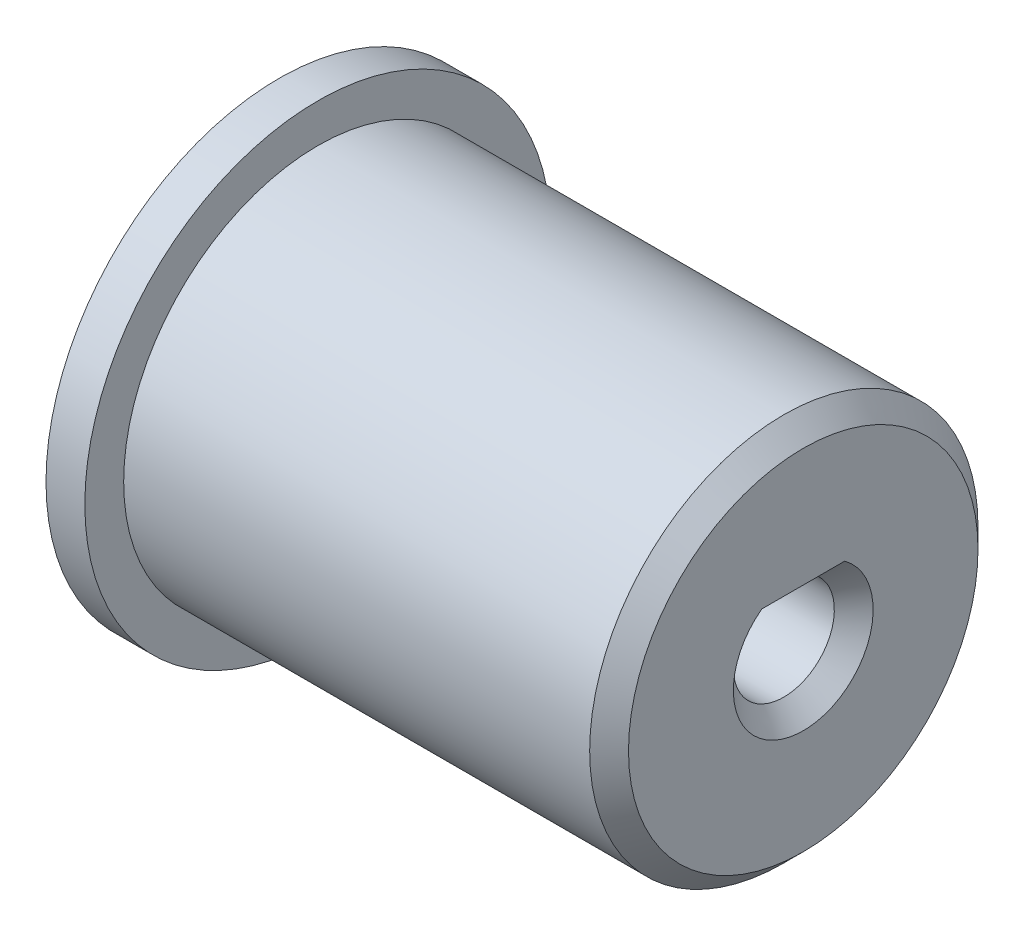
ISO-10303-21;
HEADER;
FILE_DESCRIPTION(('STEP AP214'),'2;1');
FILE_NAME('part.step','',(''),(''),'','','');
FILE_SCHEMA(('AUTOMOTIVE_DESIGN { 1 0 10303 214 1 1 1 1 }'));
ENDSEC;
DATA;
#1=APPLICATION_CONTEXT('core data for automotive mechanical design processes');
#2=APPLICATION_PROTOCOL_DEFINITION('international standard','automotive_design',2000,#1);
#3=PRODUCT_CONTEXT('',#1,'mechanical');
#4=PRODUCT('Part','Part','',(#3));
#5=PRODUCT_RELATED_PRODUCT_CATEGORY('part','',(#4));
#6=PRODUCT_DEFINITION_FORMATION('','',#4);
#7=PRODUCT_DEFINITION_CONTEXT('part definition',#1,'design');
#8=PRODUCT_DEFINITION('design','',#6,#7);
#9=PRODUCT_DEFINITION_SHAPE('','',#8);
#10=(LENGTH_UNIT() NAMED_UNIT(*) SI_UNIT(.MILLI.,.METRE.));
#11=(NAMED_UNIT(*) PLANE_ANGLE_UNIT() SI_UNIT($,.RADIAN.));
#12=(NAMED_UNIT(*) SI_UNIT($,.STERADIAN.) SOLID_ANGLE_UNIT());
#13=UNCERTAINTY_MEASURE_WITH_UNIT(LENGTH_MEASURE(1.E-05),#10,'distance_accuracy_value','');
#14=(GEOMETRIC_REPRESENTATION_CONTEXT(3) GLOBAL_UNCERTAINTY_ASSIGNED_CONTEXT((#13)) GLOBAL_UNIT_ASSIGNED_CONTEXT((#10,
#11,#12)) REPRESENTATION_CONTEXT('',''));
#15=CARTESIAN_POINT('',(0.,0.,0.));
#16=DIRECTION('',(0.,0.,1.));
#17=DIRECTION('',(1.,0.,0.));
#18=AXIS2_PLACEMENT_3D('',#15,#16,#17);
#19=CARTESIAN_POINT('',(25.,0.,0.));
#20=DIRECTION('',(-1.,0.,0.));
#21=DIRECTION('',(0.,0.,1.));
#22=AXIS2_PLACEMENT_3D('',#19,#20,#21);
#23=CYLINDRICAL_SURFACE('',#22,10.);
#24=CARTESIAN_POINT('',(24.,0.,0.));
#25=DIRECTION('',(1.,0.,0.));
#26=DIRECTION('',(0.,0.,-1.));
#27=AXIS2_PLACEMENT_3D('',#24,#25,#26);
#28=CIRCLE('',#27,10.);
#29=CARTESIAN_POINT('',(24.,0.,-10.));
#30=VERTEX_POINT('',#29);
#31=EDGE_CURVE('E247',#30,#30,#28,.F.);
#32=ORIENTED_EDGE('',*,*,#31,.T.);
#33=EDGE_LOOP('',(#32));
#34=FACE_BOUND('',#33,.T.);
#35=CARTESIAN_POINT('',(0.,0.,0.));
#36=DIRECTION('',(1.,0.,0.));
#37=DIRECTION('',(0.,0.,-1.));
#38=AXIS2_PLACEMENT_3D('',#35,#36,#37);
#39=CIRCLE('',#38,10.);
#40=CARTESIAN_POINT('',(0.,0.,-10.));
#41=VERTEX_POINT('',#40);
#42=EDGE_CURVE('E128',#41,#41,#39,.T.);
#43=ORIENTED_EDGE('',*,*,#42,.T.);
#44=EDGE_LOOP('',(#43));
#45=FACE_BOUND('',#44,.T.);
#46=ADVANCED_FACE('F47',(#34,#45),#23,.T.);
#47=CARTESIAN_POINT('',(25.,0.,0.));
#48=DIRECTION('',(1.,0.,0.));
#49=DIRECTION('',(0.,0.,-1.));
#50=AXIS2_PLACEMENT_3D('',#47,#48,#49);
#51=PLANE('',#50);
#52=CARTESIAN_POINT('',(25.,0.,0.));
#53=DIRECTION('',(1.,0.,0.));
#54=DIRECTION('',(0.,0.,-1.));
#55=AXIS2_PLACEMENT_3D('',#52,#53,#54);
#56=CIRCLE('',#55,9.00000000000001);
#57=CARTESIAN_POINT('',(25.,0.,-9.00000000000001));
#58=VERTEX_POINT('',#57);
#59=EDGE_CURVE('E149',#58,#58,#56,.T.);
#60=ORIENTED_EDGE('',*,*,#59,.T.);
#61=EDGE_LOOP('',(#60));
#62=FACE_BOUND('',#61,.T.);
#63=CARTESIAN_POINT('',(25.,0.,0.));
#64=DIRECTION('',(1.,0.,0.));
#65=DIRECTION('',(0.,0.,-1.));
#66=AXIS2_PLACEMENT_3D('',#63,#64,#65);
#67=CIRCLE('',#66,3.60000000000001);
#68=CARTESIAN_POINT('',(25.,2.90000000000001,-2.13307290077016));
#69=VERTEX_POINT('',#68);
#70=CARTESIAN_POINT('',(25.,2.90000000000001,2.13307290077016));
#71=VERTEX_POINT('',#70);
#72=EDGE_CURVE('E61',#69,#71,#67,.F.);
#73=ORIENTED_EDGE('',*,*,#72,.T.);
#74=DIRECTION('',(0.,0.,-1.));
#75=VECTOR('',#74,1.);
#76=CARTESIAN_POINT('',(25.,2.90000000000001,-1.77482393492989));
#77=LINE('',#76,#75);
#78=EDGE_CURVE('E141',#71,#69,#77,.T.);
#79=ORIENTED_EDGE('',*,*,#78,.T.);
#80=EDGE_LOOP('',(#73,#79));
#81=FACE_BOUND('',#80,.T.);
#82=ADVANCED_FACE('F199',(#62,#81),#51,.T.);
#83=CARTESIAN_POINT('',(-2.,0.,0.));
#84=DIRECTION('',(1.,0.,0.));
#85=DIRECTION('',(0.,0.,-1.));
#86=AXIS2_PLACEMENT_3D('',#83,#84,#85);
#87=CYLINDRICAL_SURFACE('',#86,12.);
#88=CARTESIAN_POINT('',(-2.,0.,0.));
#89=DIRECTION('',(-1.,0.,0.));
#90=DIRECTION('',(0.,0.,1.));
#91=AXIS2_PLACEMENT_3D('',#88,#89,#90);
#92=CIRCLE('',#91,12.);
#93=CARTESIAN_POINT('',(-2.,0.,12.));
#94=VERTEX_POINT('',#93);
#95=EDGE_CURVE('E127',#94,#94,#92,.T.);
#96=ORIENTED_EDGE('',*,*,#95,.F.);
#97=EDGE_LOOP('',(#96));
#98=FACE_BOUND('',#97,.T.);
#99=CARTESIAN_POINT('',(0.,0.,0.));
#100=DIRECTION('',(-1.,0.,0.));
#101=DIRECTION('',(0.,0.,1.));
#102=AXIS2_PLACEMENT_3D('',#99,#100,#101);
#103=CIRCLE('',#102,12.);
#104=CARTESIAN_POINT('',(0.,0.,12.));
#105=VERTEX_POINT('',#104);
#106=EDGE_CURVE('E124',#105,#105,#103,.T.);
#107=ORIENTED_EDGE('',*,*,#106,.T.);
#108=EDGE_LOOP('',(#107));
#109=FACE_BOUND('',#108,.T.);
#110=ADVANCED_FACE('F202',(#98,#109),#87,.T.);
#111=CARTESIAN_POINT('',(-2.,0.,0.));
#112=DIRECTION('',(-1.,0.,0.));
#113=DIRECTION('',(0.,0.,1.));
#114=AXIS2_PLACEMENT_3D('',#111,#112,#113);
#115=PLANE('',#114);
#116=CARTESIAN_POINT('',(-2.,0.,4.25));
#117=DIRECTION('',(-1.,0.,0.));
#118=DIRECTION('',(0.,0.,1.));
#119=AXIS2_PLACEMENT_3D('',#116,#117,#118);
#120=CIRCLE('',#119,2.55000000000002);
#121=CARTESIAN_POINT('',(-2.,0.,6.80000000000002));
#122=VERTEX_POINT('',#121);
#123=EDGE_CURVE('E56',#122,#122,#120,.F.);
#124=ORIENTED_EDGE('',*,*,#123,.T.);
#125=EDGE_LOOP('',(#124));
#126=FACE_BOUND('',#125,.T.);
#127=CARTESIAN_POINT('',(-2.,0.,-4.25));
#128=DIRECTION('',(-1.,0.,0.));
#129=DIRECTION('',(0.,0.,1.));
#130=AXIS2_PLACEMENT_3D('',#127,#128,#129);
#131=CIRCLE('',#130,2.55000000000002);
#132=CARTESIAN_POINT('',(-2.,0.,-1.69999999999998));
#133=VERTEX_POINT('',#132);
#134=EDGE_CURVE('E249',#133,#133,#131,.F.);
#135=ORIENTED_EDGE('',*,*,#134,.T.);
#136=EDGE_LOOP('',(#135));
#137=FACE_BOUND('',#136,.T.);
#138=ORIENTED_EDGE('',*,*,#95,.T.);
#139=EDGE_LOOP('',(#138));
#140=FACE_BOUND('',#139,.T.);
#141=ADVANCED_FACE('F213',(#126,#137,#140),#115,.T.);
#142=CARTESIAN_POINT('',(0.,0.,0.));
#143=DIRECTION('',(-1.,0.,0.));
#144=DIRECTION('',(0.,0.,1.));
#145=AXIS2_PLACEMENT_3D('',#142,#143,#144);
#146=PLANE('',#145);
#147=ORIENTED_EDGE('',*,*,#42,.F.);
#148=EDGE_LOOP('',(#147));
#149=FACE_BOUND('',#148,.T.);
#150=ORIENTED_EDGE('',*,*,#106,.F.);
#151=EDGE_LOOP('',(#150));
#152=FACE_BOUND('',#151,.T.);
#153=ADVANCED_FACE('F214',(#149,#152),#146,.F.);
#154=CARTESIAN_POINT('',(9.99999999999999,0.,0.));
#155=DIRECTION('',(1.,0.,0.));
#156=DIRECTION('',(0.,0.,-1.));
#157=AXIS2_PLACEMENT_3D('',#154,#155,#156);
#158=CYLINDRICAL_SURFACE('',#157,2.6);
#159=DIRECTION('',(1.,0.,0.));
#160=VECTOR('',#159,1.);
#161=CARTESIAN_POINT('',(9.99999999999999,1.9,1.77482393492989));
#162=LINE('',#161,#160);
#163=CARTESIAN_POINT('',(9.99999999999999,1.9,1.77482393492989));
#164=VERTEX_POINT('',#163);
#165=CARTESIAN_POINT('',(24.,1.9,1.77482393492989));
#166=VERTEX_POINT('',#165);
#167=EDGE_CURVE('E118',#164,#166,#162,.T.);
#168=ORIENTED_EDGE('',*,*,#167,.T.);
#169=CARTESIAN_POINT('',(24.,0.,0.));
#170=DIRECTION('',(1.,0.,0.));
#171=DIRECTION('',(0.,0.,-1.));
#172=AXIS2_PLACEMENT_3D('',#169,#170,#171);
#173=CIRCLE('',#172,2.6);
#174=CARTESIAN_POINT('',(24.,1.9,-1.77482393492989));
#175=VERTEX_POINT('',#174);
#176=EDGE_CURVE('E148',#166,#175,#173,.T.);
#177=ORIENTED_EDGE('',*,*,#176,.T.);
#178=DIRECTION('',(1.,0.,0.));
#179=VECTOR('',#178,1.);
#180=CARTESIAN_POINT('',(9.99999999999999,1.9,-1.77482393492989));
#181=LINE('',#180,#179);
#182=CARTESIAN_POINT('',(9.99999999999999,1.9,-1.77482393492989));
#183=VERTEX_POINT('',#182);
#184=EDGE_CURVE('E120',#183,#175,#181,.T.);
#185=ORIENTED_EDGE('',*,*,#184,.F.);
#186=CARTESIAN_POINT('',(9.99999999999999,0.,0.));
#187=DIRECTION('',(1.,0.,0.));
#188=DIRECTION('',(0.,0.,-1.));
#189=AXIS2_PLACEMENT_3D('',#186,#187,#188);
#190=CIRCLE('',#189,2.6);
#191=EDGE_CURVE('E108',#164,#183,#190,.T.);
#192=ORIENTED_EDGE('',*,*,#191,.F.);
#193=EDGE_LOOP('',(#168,#177,#185,#192));
#194=FACE_BOUND('',#193,.T.);
#195=ADVANCED_FACE('F217',(#194),#158,.F.);
#196=CARTESIAN_POINT('',(9.99999999999999,1.9,1.77482393492989));
#197=DIRECTION('',(0.,1.,0.));
#198=DIRECTION('',(0.,0.,1.));
#199=AXIS2_PLACEMENT_3D('',#196,#197,#198);
#200=PLANE('',#199);
#201=ORIENTED_EDGE('',*,*,#184,.T.);
#202=DIRECTION('',(0.,0.,1.));
#203=VECTOR('',#202,1.);
#204=CARTESIAN_POINT('',(24.,1.9,1.77482393492989));
#205=LINE('',#204,#203);
#206=EDGE_CURVE('E139',#175,#166,#205,.T.);
#207=ORIENTED_EDGE('',*,*,#206,.T.);
#208=ORIENTED_EDGE('',*,*,#167,.F.);
#209=DIRECTION('',(0.,0.,1.));
#210=VECTOR('',#209,1.);
#211=CARTESIAN_POINT('',(9.99999999999999,1.9,1.77482393492989));
#212=LINE('',#211,#210);
#213=EDGE_CURVE('E114',#183,#164,#212,.T.);
#214=ORIENTED_EDGE('',*,*,#213,.F.);
#215=EDGE_LOOP('',(#201,#207,#208,#214));
#216=FACE_BOUND('',#215,.T.);
#217=ADVANCED_FACE('F223',(#216),#200,.F.);
#218=CARTESIAN_POINT('',(9.99999999999999,0.,0.));
#219=DIRECTION('',(1.,0.,0.));
#220=DIRECTION('',(0.,0.,-1.));
#221=AXIS2_PLACEMENT_3D('',#218,#219,#220);
#222=PLANE('',#221);
#223=ORIENTED_EDGE('',*,*,#191,.T.);
#224=ORIENTED_EDGE('',*,*,#213,.T.);
#225=EDGE_LOOP('',(#223,#224));
#226=FACE_BOUND('',#225,.T.);
#227=ADVANCED_FACE('F174',(#226),#222,.T.);
#228=CARTESIAN_POINT('',(24.,0.,0.));
#229=DIRECTION('',(1.,0.,0.));
#230=DIRECTION('',(0.,0.,-1.));
#231=AXIS2_PLACEMENT_3D('',#228,#229,#230);
#232=CONICAL_SURFACE('',#231,2.6,0.785398163397451);
#233=CARTESIAN_POINT('',(24.,1.9,1.77482393492989));
#234=CARTESIAN_POINT('',(24.0828218189625,1.98282181896255,1.80748053933933));
#235=CARTESIAN_POINT('',(24.1658034598061,2.06580345980609,1.83931634121937));
#236=CARTESIAN_POINT('',(24.332029277271,2.23202927727105,1.90153004187719));
#237=CARTESIAN_POINT('',(24.4152734214577,2.31527342145772,1.93190811378654));
#238=CARTESIAN_POINT('',(24.5819830489262,2.48198304892625,1.9913963757484));
#239=CARTESIAN_POINT('',(24.6654485218535,2.56544852185349,2.02050662404199));
#240=CARTESIAN_POINT('',(24.8325824747131,2.73258247471316,2.07760108432667));
#241=CARTESIAN_POINT('',(24.9162509775886,2.81625097758856,2.10558516211079));
#242=CARTESIAN_POINT('',(25.,2.90000000000001,2.13307290077016));
#243=B_SPLINE_CURVE_WITH_KNOTS('',3,(#233,#234,#235,#236,#237,#238,#239,#240,#241,#242),
.UNSPECIFIED.,.F.,.F.,(4,2,2,2,4),(0.,0.364778310430288,0.729513189124214,1.09423129497589,
1.45899273674608),.UNSPECIFIED.);
#244=EDGE_CURVE('E106',#71,#166,#243,.F.);
#245=ORIENTED_EDGE('',*,*,#244,.F.);
#246=ORIENTED_EDGE('',*,*,#72,.F.);
#247=CARTESIAN_POINT('',(25.,2.90000000000001,-2.13307290077016));
#248=CARTESIAN_POINT('',(24.9162509775886,2.81625097758856,-2.10558516211079));
#249=CARTESIAN_POINT('',(24.8325824747132,2.73258247471316,-2.07760108432667));
#250=CARTESIAN_POINT('',(24.6654485218535,2.56544852185349,-2.02050662404199));
#251=CARTESIAN_POINT('',(24.5819830489262,2.48198304892625,-1.9913963757484));
#252=CARTESIAN_POINT('',(24.4152734214577,2.31527342145772,-1.93190811378654));
#253=CARTESIAN_POINT('',(24.332029277271,2.23202927727105,-1.90153004187719));
#254=CARTESIAN_POINT('',(24.1658034598061,2.06580345980609,-1.83931634121937));
#255=CARTESIAN_POINT('',(24.0828218189625,1.98282181896255,-1.80748053933933));
#256=CARTESIAN_POINT('',(24.,1.9,-1.77482393492989));
#257=B_SPLINE_CURVE_WITH_KNOTS('',3,(#247,#248,#249,#250,#251,#252,#253,#254,#255,#256),
.UNSPECIFIED.,.F.,.F.,(4,2,2,2,4),(0.,0.364761441770191,0.729479547621869,1.09421442631579,
1.45899273674608),.UNSPECIFIED.);
#258=EDGE_CURVE('E75',#175,#69,#257,.F.);
#259=ORIENTED_EDGE('',*,*,#258,.F.);
#260=ORIENTED_EDGE('',*,*,#176,.F.);
#261=EDGE_LOOP('',(#245,#246,#259,#260));
#262=FACE_BOUND('',#261,.T.);
#263=ADVANCED_FACE('F169',(#262),#232,.F.);
#264=CARTESIAN_POINT('',(24.,1.9,1.77482393492989));
#265=DIRECTION('',(0.707106781186549,-0.707106781186546,0.));
#266=DIRECTION('',(0.,0.,-1.));
#267=AXIS2_PLACEMENT_3D('',#264,#265,#266);
#268=PLANE('',#267);
#269=ORIENTED_EDGE('',*,*,#258,.T.);
#270=ORIENTED_EDGE('',*,*,#78,.F.);
#271=ORIENTED_EDGE('',*,*,#244,.T.);
#272=ORIENTED_EDGE('',*,*,#206,.F.);
#273=EDGE_LOOP('',(#269,#270,#271,#272));
#274=FACE_BOUND('',#273,.T.);
#275=ADVANCED_FACE('F163',(#274),#268,.T.);
#276=CARTESIAN_POINT('',(25.,0.,0.));
#277=DIRECTION('',(-1.,0.,0.));
#278=DIRECTION('',(0.,0.,1.));
#279=AXIS2_PLACEMENT_3D('',#276,#277,#278);
#280=CONICAL_SURFACE('',#279,9.00000000000001,0.785398163397445);
#281=ORIENTED_EDGE('',*,*,#31,.F.);
#282=EDGE_LOOP('',(#281));
#283=FACE_BOUND('',#282,.T.);
#284=ORIENTED_EDGE('',*,*,#59,.F.);
#285=EDGE_LOOP('',(#284));
#286=FACE_BOUND('',#285,.T.);
#287=ADVANCED_FACE('F179',(#283,#286),#280,.T.);
#288=CARTESIAN_POINT('',(5.,0.,4.25));
#289=DIRECTION('',(-1.,0.,0.));
#290=DIRECTION('',(0.,0.,1.));
#291=AXIS2_PLACEMENT_3D('',#288,#289,#290);
#292=CONICAL_SURFACE('',#291,1.55,1.02974425867665);
#293=CARTESIAN_POINT('',(5.93133395949272,0.,4.25));
#294=VERTEX_POINT('',#293);
#295=VERTEX_LOOP('',#294);
#296=FACE_BOUND('',#295,.T.);
#297=CARTESIAN_POINT('',(5.,0.,4.25));
#298=DIRECTION('',(-1.,0.,0.));
#299=DIRECTION('',(0.,0.,1.));
#300=AXIS2_PLACEMENT_3D('',#297,#298,#299);
#301=CIRCLE('',#300,1.55);
#302=CARTESIAN_POINT('',(5.,0.,5.8));
#303=VERTEX_POINT('',#302);
#304=EDGE_CURVE('E105',#303,#303,#301,.T.);
#305=ORIENTED_EDGE('',*,*,#304,.T.);
#306=EDGE_LOOP('',(#305));
#307=FACE_BOUND('',#306,.T.);
#308=ADVANCED_FACE('F181',(#296,#307),#292,.F.);
#309=CARTESIAN_POINT('',(-2.,0.,4.25));
#310=DIRECTION('',(-1.,0.,0.));
#311=DIRECTION('',(0.,0.,1.));
#312=AXIS2_PLACEMENT_3D('',#309,#310,#311);
#313=CYLINDRICAL_SURFACE('',#312,1.55);
#314=CARTESIAN_POINT('',(-0.999999999999982,0.,4.25));
#315=DIRECTION('',(-1.,0.,0.));
#316=DIRECTION('',(0.,0.,1.));
#317=AXIS2_PLACEMENT_3D('',#314,#315,#316);
#318=CIRCLE('',#317,1.55);
#319=CARTESIAN_POINT('',(-0.999999999999982,0.,5.8));
#320=VERTEX_POINT('',#319);
#321=EDGE_CURVE('E243',#320,#320,#318,.T.);
#322=ORIENTED_EDGE('',*,*,#321,.T.);
#323=EDGE_LOOP('',(#322));
#324=FACE_BOUND('',#323,.T.);
#325=ORIENTED_EDGE('',*,*,#304,.F.);
#326=EDGE_LOOP('',(#325));
#327=FACE_BOUND('',#326,.T.);
#328=ADVANCED_FACE('F92',(#324,#327),#313,.F.);
#329=CARTESIAN_POINT('',(5.,0.,-4.25));
#330=DIRECTION('',(-1.,0.,0.));
#331=DIRECTION('',(0.,0.,1.));
#332=AXIS2_PLACEMENT_3D('',#329,#330,#331);
#333=CONICAL_SURFACE('',#332,1.55,1.02974425867665);
#334=CARTESIAN_POINT('',(5.93133395949272,0.,-4.25));
#335=VERTEX_POINT('',#334);
#336=VERTEX_LOOP('',#335);
#337=FACE_BOUND('',#336,.T.);
#338=CARTESIAN_POINT('',(5.,0.,-4.25));
#339=DIRECTION('',(-1.,0.,0.));
#340=DIRECTION('',(0.,0.,1.));
#341=AXIS2_PLACEMENT_3D('',#338,#339,#340);
#342=CIRCLE('',#341,1.55);
#343=CARTESIAN_POINT('',(5.,0.,-2.7));
#344=VERTEX_POINT('',#343);
#345=EDGE_CURVE('E97',#344,#344,#342,.T.);
#346=ORIENTED_EDGE('',*,*,#345,.T.);
#347=EDGE_LOOP('',(#346));
#348=FACE_BOUND('',#347,.T.);
#349=ADVANCED_FACE('F93',(#337,#348),#333,.F.);
#350=CARTESIAN_POINT('',(-2.,0.,-4.25));
#351=DIRECTION('',(-1.,0.,0.));
#352=DIRECTION('',(0.,0.,1.));
#353=AXIS2_PLACEMENT_3D('',#350,#351,#352);
#354=CYLINDRICAL_SURFACE('',#353,1.55);
#355=CARTESIAN_POINT('',(-0.999999999999982,0.,-4.25));
#356=DIRECTION('',(-1.,0.,0.));
#357=DIRECTION('',(0.,0.,1.));
#358=AXIS2_PLACEMENT_3D('',#355,#356,#357);
#359=CIRCLE('',#358,1.55);
#360=CARTESIAN_POINT('',(-0.999999999999982,0.,-2.7));
#361=VERTEX_POINT('',#360);
#362=EDGE_CURVE('E11',#361,#361,#359,.T.);
#363=ORIENTED_EDGE('',*,*,#362,.T.);
#364=EDGE_LOOP('',(#363));
#365=FACE_BOUND('',#364,.T.);
#366=ORIENTED_EDGE('',*,*,#345,.F.);
#367=EDGE_LOOP('',(#366));
#368=FACE_BOUND('',#367,.T.);
#369=ADVANCED_FACE('F94',(#365,#368),#354,.F.);
#370=CARTESIAN_POINT('',(-0.999999999999982,0.,4.25));
#371=DIRECTION('',(-1.,0.,0.));
#372=DIRECTION('',(0.,0.,1.));
#373=AXIS2_PLACEMENT_3D('',#370,#371,#372);
#374=CONICAL_SURFACE('',#373,1.55,0.785398163397449);
#375=ORIENTED_EDGE('',*,*,#123,.F.);
#376=EDGE_LOOP('',(#375));
#377=FACE_BOUND('',#376,.T.);
#378=ORIENTED_EDGE('',*,*,#321,.F.);
#379=EDGE_LOOP('',(#378));
#380=FACE_BOUND('',#379,.T.);
#381=ADVANCED_FACE('F183',(#377,#380),#374,.F.);
#382=CARTESIAN_POINT('',(-0.999999999999982,0.,-4.25));
#383=DIRECTION('',(-1.,0.,0.));
#384=DIRECTION('',(0.,0.,1.));
#385=AXIS2_PLACEMENT_3D('',#382,#383,#384);
#386=CONICAL_SURFACE('',#385,1.55,0.785398163397449);
#387=ORIENTED_EDGE('',*,*,#134,.F.);
#388=EDGE_LOOP('',(#387));
#389=FACE_BOUND('',#388,.T.);
#390=ORIENTED_EDGE('',*,*,#362,.F.);
#391=EDGE_LOOP('',(#390));
#392=FACE_BOUND('',#391,.T.);
#393=ADVANCED_FACE('F55',(#389,#392),#386,.F.);
#394=CLOSED_SHELL('',(#46,#82,#110,#141,#153,#195,#217,#227,#263,#275,#287,#308,#328,#349,#369,
#381,#393));
#395=MANIFOLD_SOLID_BREP('B2',#394);
#396=ADVANCED_BREP_SHAPE_REPRESENTATION('',(#18,#395),#14);
#397=SHAPE_DEFINITION_REPRESENTATION(#9,#396);
ENDSEC;
END-ISO-10303-21;
